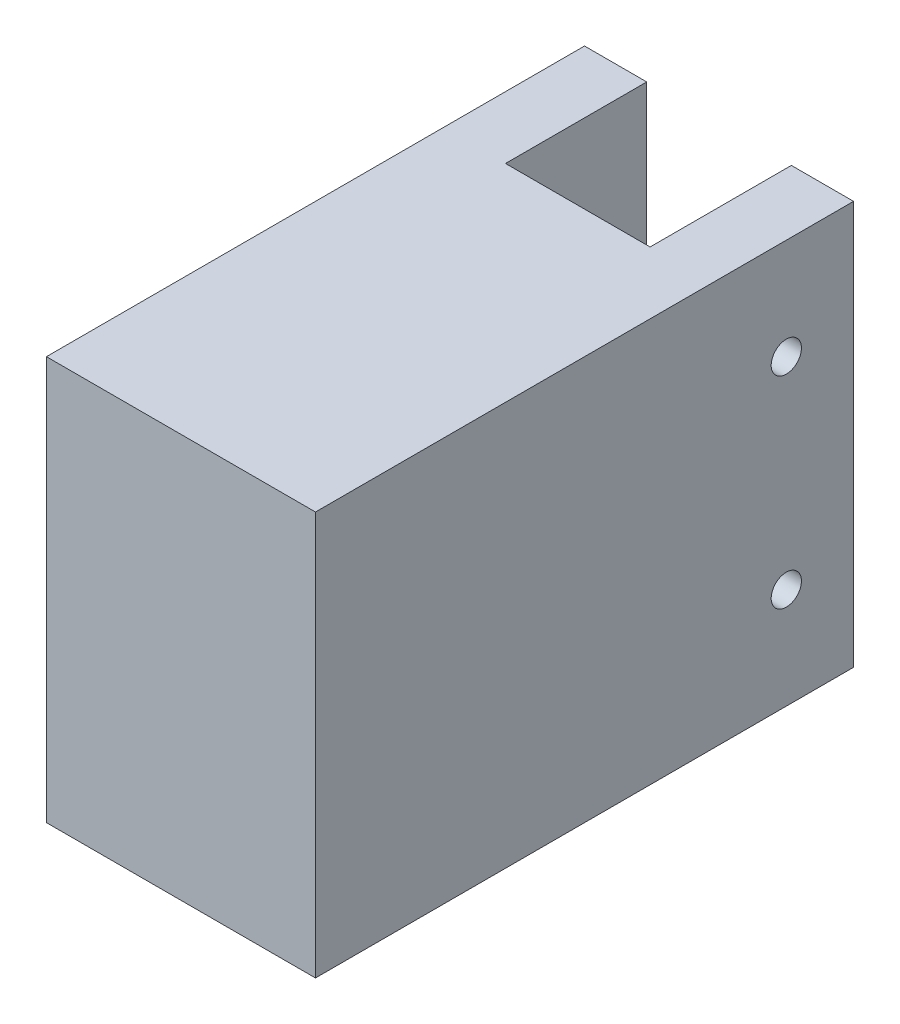
ISO-10303-21;
HEADER;
FILE_DESCRIPTION(('STEP AP214'),'2;1');
FILE_NAME('part.step','',(''),(''),'','','');
FILE_SCHEMA(('AUTOMOTIVE_DESIGN { 1 0 10303 214 1 1 1 1 }'));
ENDSEC;
DATA;
#1=APPLICATION_CONTEXT('core data for automotive mechanical design processes');
#2=APPLICATION_PROTOCOL_DEFINITION('international standard','automotive_design',2000,#1);
#3=PRODUCT_CONTEXT('',#1,'mechanical');
#4=PRODUCT('Part','Part','',(#3));
#5=PRODUCT_RELATED_PRODUCT_CATEGORY('part','',(#4));
#6=PRODUCT_DEFINITION_FORMATION('','',#4);
#7=PRODUCT_DEFINITION_CONTEXT('part definition',#1,'design');
#8=PRODUCT_DEFINITION('design','',#6,#7);
#9=PRODUCT_DEFINITION_SHAPE('','',#8);
#10=(LENGTH_UNIT() NAMED_UNIT(*) SI_UNIT(.MILLI.,.METRE.));
#11=(NAMED_UNIT(*) PLANE_ANGLE_UNIT() SI_UNIT($,.RADIAN.));
#12=(NAMED_UNIT(*) SI_UNIT($,.STERADIAN.) SOLID_ANGLE_UNIT());
#13=UNCERTAINTY_MEASURE_WITH_UNIT(LENGTH_MEASURE(1.E-05),#10,'distance_accuracy_value','');
#14=(GEOMETRIC_REPRESENTATION_CONTEXT(3) GLOBAL_UNCERTAINTY_ASSIGNED_CONTEXT((#13)) GLOBAL_UNIT_ASSIGNED_CONTEXT((#10,
#11,#12)) REPRESENTATION_CONTEXT('',''));
#15=CARTESIAN_POINT('',(0.,0.,0.));
#16=DIRECTION('',(0.,0.,1.));
#17=DIRECTION('',(1.,0.,0.));
#18=AXIS2_PLACEMENT_3D('',#15,#16,#17);
#19=CARTESIAN_POINT('',(40.,0.,0.));
#20=DIRECTION('',(-1.,0.,0.));
#21=DIRECTION('',(0.,0.,1.));
#22=AXIS2_PLACEMENT_3D('',#19,#20,#21);
#23=CYLINDRICAL_SURFACE('',#22,17.65);
#24=CARTESIAN_POINT('',(0.,0.,0.));
#25=DIRECTION('',(1.,0.,0.));
#26=DIRECTION('',(0.,0.,-1.));
#27=AXIS2_PLACEMENT_3D('',#24,#25,#26);
#28=CIRCLE('',#27,17.65);
#29=CARTESIAN_POINT('',(0.,0.,-17.65));
#30=VERTEX_POINT('',#29);
#31=EDGE_CURVE('E97',#30,#30,#28,.T.);
#32=ORIENTED_EDGE('',*,*,#31,.F.);
#33=EDGE_LOOP('',(#32));
#34=FACE_BOUND('',#33,.T.);
#35=CARTESIAN_POINT('',(25.,0.,0.));
#36=DIRECTION('',(1.,0.,0.));
#37=DIRECTION('',(0.,0.,-1.));
#38=AXIS2_PLACEMENT_3D('',#35,#36,#37);
#39=CIRCLE('',#38,17.65);
#40=CARTESIAN_POINT('',(25.,0.,-17.65));
#41=VERTEX_POINT('',#40);
#42=EDGE_CURVE('E133',#41,#41,#39,.T.);
#43=ORIENTED_EDGE('',*,*,#42,.T.);
#44=EDGE_LOOP('',(#43));
#45=FACE_BOUND('',#44,.T.);
#46=ADVANCED_FACE('F33',(#34,#45),#23,.F.);
#47=CARTESIAN_POINT('',(40.,0.,0.));
#48=DIRECTION('',(1.,0.,0.));
#49=DIRECTION('',(0.,0.,-1.));
#50=AXIS2_PLACEMENT_3D('',#47,#48,#49);
#51=PLANE('',#50);
#52=CARTESIAN_POINT('',(40.,-15.,-40.));
#53=DIRECTION('',(1.,0.,0.));
#54=DIRECTION('',(0.,0.,-1.));
#55=AXIS2_PLACEMENT_3D('',#52,#53,#54);
#56=CIRCLE('',#55,2.25);
#57=CARTESIAN_POINT('',(40.,-15.,-42.25));
#58=VERTEX_POINT('',#57);
#59=EDGE_CURVE('E149',#58,#58,#56,.T.);
#60=ORIENTED_EDGE('',*,*,#59,.F.);
#61=EDGE_LOOP('',(#60));
#62=FACE_BOUND('',#61,.T.);
#63=CARTESIAN_POINT('',(40.,15.,-40.));
#64=DIRECTION('',(1.,0.,0.));
#65=DIRECTION('',(0.,0.,1.));
#66=AXIS2_PLACEMENT_3D('',#63,#64,#65);
#67=CIRCLE('',#66,2.25);
#68=CARTESIAN_POINT('',(40.,15.,-37.75));
#69=VERTEX_POINT('',#68);
#70=EDGE_CURVE('E148',#69,#69,#67,.T.);
#71=ORIENTED_EDGE('',*,*,#70,.F.);
#72=EDGE_LOOP('',(#71));
#73=FACE_BOUND('',#72,.T.);
#74=DIRECTION('',(0.,-1.,0.));
#75=VECTOR('',#74,1.);
#76=CARTESIAN_POINT('',(40.,-30.,30.));
#77=LINE('',#76,#75);
#78=CARTESIAN_POINT('',(40.,30.,30.));
#79=VERTEX_POINT('',#78);
#80=CARTESIAN_POINT('',(40.,-30.,30.));
#81=VERTEX_POINT('',#80);
#82=EDGE_CURVE('E86',#79,#81,#77,.T.);
#83=ORIENTED_EDGE('',*,*,#82,.T.);
#84=DIRECTION('',(0.,0.,-1.));
#85=VECTOR('',#84,1.);
#86=CARTESIAN_POINT('',(40.,-30.,-30.));
#87=LINE('',#86,#85);
#88=CARTESIAN_POINT('',(40.,-30.,-50.));
#89=VERTEX_POINT('',#88);
#90=EDGE_CURVE('E162',#81,#89,#87,.T.);
#91=ORIENTED_EDGE('',*,*,#90,.T.);
#92=DIRECTION('',(0.,-1.,0.));
#93=VECTOR('',#92,1.);
#94=CARTESIAN_POINT('',(40.,30.,-50.));
#95=LINE('',#94,#93);
#96=CARTESIAN_POINT('',(40.,30.,-50.));
#97=VERTEX_POINT('',#96);
#98=EDGE_CURVE('E152',#97,#89,#95,.T.);
#99=ORIENTED_EDGE('',*,*,#98,.F.);
#100=DIRECTION('',(0.,0.,1.));
#101=VECTOR('',#100,1.);
#102=CARTESIAN_POINT('',(40.,30.,-30.));
#103=LINE('',#102,#101);
#104=EDGE_CURVE('E59',#97,#79,#103,.T.);
#105=ORIENTED_EDGE('',*,*,#104,.T.);
#106=EDGE_LOOP('',(#83,#91,#99,#105));
#107=FACE_BOUND('',#106,.T.);
#108=ADVANCED_FACE('F166',(#62,#73,#107),#51,.T.);
#109=CARTESIAN_POINT('',(0.,0.,0.));
#110=DIRECTION('',(1.,0.,0.));
#111=DIRECTION('',(0.,0.,-1.));
#112=AXIS2_PLACEMENT_3D('',#109,#110,#111);
#113=PLANE('',#112);
#114=CARTESIAN_POINT('',(0.,-15.,-40.));
#115=DIRECTION('',(1.,0.,0.));
#116=DIRECTION('',(0.,0.,-1.));
#117=AXIS2_PLACEMENT_3D('',#114,#115,#116);
#118=CIRCLE('',#117,2.25);
#119=CARTESIAN_POINT('',(0.,-15.,-42.25));
#120=VERTEX_POINT('',#119);
#121=EDGE_CURVE('E137',#120,#120,#118,.T.);
#122=ORIENTED_EDGE('',*,*,#121,.T.);
#123=EDGE_LOOP('',(#122));
#124=FACE_BOUND('',#123,.T.);
#125=CARTESIAN_POINT('',(0.,15.,-40.));
#126=DIRECTION('',(1.,0.,0.));
#127=DIRECTION('',(0.,0.,1.));
#128=AXIS2_PLACEMENT_3D('',#125,#126,#127);
#129=CIRCLE('',#128,2.25);
#130=CARTESIAN_POINT('',(0.,15.,-37.75));
#131=VERTEX_POINT('',#130);
#132=EDGE_CURVE('E136',#131,#131,#129,.T.);
#133=ORIENTED_EDGE('',*,*,#132,.T.);
#134=EDGE_LOOP('',(#133));
#135=FACE_BOUND('',#134,.T.);
#136=DIRECTION('',(0.,-1.,0.));
#137=VECTOR('',#136,1.);
#138=CARTESIAN_POINT('',(0.,-30.,30.));
#139=LINE('',#138,#137);
#140=CARTESIAN_POINT('',(0.,30.,30.));
#141=VERTEX_POINT('',#140);
#142=CARTESIAN_POINT('',(0.,-30.,30.));
#143=VERTEX_POINT('',#142);
#144=EDGE_CURVE('E92',#141,#143,#139,.T.);
#145=ORIENTED_EDGE('',*,*,#144,.F.);
#146=DIRECTION('',(0.,0.,1.));
#147=VECTOR('',#146,1.);
#148=CARTESIAN_POINT('',(0.,30.,-30.));
#149=LINE('',#148,#147);
#150=CARTESIAN_POINT('',(0.,30.,-50.));
#151=VERTEX_POINT('',#150);
#152=EDGE_CURVE('E73',#151,#141,#149,.T.);
#153=ORIENTED_EDGE('',*,*,#152,.F.);
#154=DIRECTION('',(0.,-1.,0.));
#155=VECTOR('',#154,1.);
#156=CARTESIAN_POINT('',(0.,30.,-50.));
#157=LINE('',#156,#155);
#158=CARTESIAN_POINT('',(0.,-30.,-50.));
#159=VERTEX_POINT('',#158);
#160=EDGE_CURVE('E140',#151,#159,#157,.T.);
#161=ORIENTED_EDGE('',*,*,#160,.T.);
#162=DIRECTION('',(0.,0.,-1.));
#163=VECTOR('',#162,1.);
#164=CARTESIAN_POINT('',(0.,-30.,-30.));
#165=LINE('',#164,#163);
#166=EDGE_CURVE('E87',#143,#159,#165,.T.);
#167=ORIENTED_EDGE('',*,*,#166,.F.);
#168=EDGE_LOOP('',(#145,#153,#161,#167));
#169=FACE_BOUND('',#168,.T.);
#170=ORIENTED_EDGE('',*,*,#31,.T.);
#171=EDGE_LOOP('',(#170));
#172=FACE_BOUND('',#171,.T.);
#173=ADVANCED_FACE('F94',(#124,#135,#169,#172),#113,.F.);
#174=CARTESIAN_POINT('',(40.,-30.,30.));
#175=DIRECTION('',(0.,0.,-1.));
#176=DIRECTION('',(-1.,0.,0.));
#177=AXIS2_PLACEMENT_3D('',#174,#175,#176);
#178=PLANE('',#177);
#179=ORIENTED_EDGE('',*,*,#144,.T.);
#180=DIRECTION('',(-1.,0.,0.));
#181=VECTOR('',#180,1.);
#182=CARTESIAN_POINT('',(40.,-30.,30.));
#183=LINE('',#182,#181);
#184=EDGE_CURVE('E11',#81,#143,#183,.T.);
#185=ORIENTED_EDGE('',*,*,#184,.F.);
#186=ORIENTED_EDGE('',*,*,#82,.F.);
#187=DIRECTION('',(-1.,0.,0.));
#188=VECTOR('',#187,1.);
#189=CARTESIAN_POINT('',(40.,30.,30.));
#190=LINE('',#189,#188);
#191=EDGE_CURVE('E42',#79,#141,#190,.T.);
#192=ORIENTED_EDGE('',*,*,#191,.T.);
#193=EDGE_LOOP('',(#179,#185,#186,#192));
#194=FACE_BOUND('',#193,.T.);
#195=ADVANCED_FACE('F35',(#194),#178,.F.);
#196=CARTESIAN_POINT('',(40.,-30.,-30.));
#197=DIRECTION('',(0.,1.,0.));
#198=DIRECTION('',(0.,0.,1.));
#199=AXIS2_PLACEMENT_3D('',#196,#197,#198);
#200=PLANE('',#199);
#201=DIRECTION('',(1.,0.,0.));
#202=VECTOR('',#201,1.);
#203=CARTESIAN_POINT('',(0.,-30.,-50.));
#204=LINE('',#203,#202);
#205=CARTESIAN_POINT('',(9.25,-30.,-50.));
#206=VERTEX_POINT('',#205);
#207=EDGE_CURVE('E145',#159,#206,#204,.T.);
#208=ORIENTED_EDGE('',*,*,#207,.T.);
#209=DIRECTION('',(0.,0.,1.));
#210=VECTOR('',#209,1.);
#211=CARTESIAN_POINT('',(9.25,-30.,-50.));
#212=LINE('',#211,#210);
#213=CARTESIAN_POINT('',(9.25,-30.,-29.));
#214=VERTEX_POINT('',#213);
#215=EDGE_CURVE('E50',#206,#214,#212,.T.);
#216=ORIENTED_EDGE('',*,*,#215,.T.);
#217=DIRECTION('',(1.,0.,0.));
#218=VECTOR('',#217,1.);
#219=CARTESIAN_POINT('',(9.25,-30.,-29.));
#220=LINE('',#219,#218);
#221=CARTESIAN_POINT('',(30.75,-30.,-29.));
#222=VERTEX_POINT('',#221);
#223=EDGE_CURVE('E348',#214,#222,#220,.T.);
#224=ORIENTED_EDGE('',*,*,#223,.T.);
#225=DIRECTION('',(0.,0.,-1.));
#226=VECTOR('',#225,1.);
#227=CARTESIAN_POINT('',(30.75,-30.,-50.));
#228=LINE('',#227,#226);
#229=CARTESIAN_POINT('',(30.75,-30.,-50.));
#230=VERTEX_POINT('',#229);
#231=EDGE_CURVE('E128',#222,#230,#228,.T.);
#232=ORIENTED_EDGE('',*,*,#231,.T.);
#233=DIRECTION('',(-1.,0.,0.));
#234=VECTOR('',#233,1.);
#235=CARTESIAN_POINT('',(40.,-30.,-50.));
#236=LINE('',#235,#234);
#237=EDGE_CURVE('E157',#89,#230,#236,.T.);
#238=ORIENTED_EDGE('',*,*,#237,.F.);
#239=ORIENTED_EDGE('',*,*,#90,.F.);
#240=ORIENTED_EDGE('',*,*,#184,.T.);
#241=ORIENTED_EDGE('',*,*,#166,.T.);
#242=EDGE_LOOP('',(#208,#216,#224,#232,#238,#239,#240,#241));
#243=FACE_BOUND('',#242,.T.);
#244=ADVANCED_FACE('F171',(#243),#200,.F.);
#245=CARTESIAN_POINT('',(40.,30.,-30.));
#246=DIRECTION('',(0.,-1.,0.));
#247=DIRECTION('',(0.,0.,-1.));
#248=AXIS2_PLACEMENT_3D('',#245,#246,#247);
#249=PLANE('',#248);
#250=DIRECTION('',(1.,0.,0.));
#251=VECTOR('',#250,1.);
#252=CARTESIAN_POINT('',(9.25,30.,-29.));
#253=LINE('',#252,#251);
#254=CARTESIAN_POINT('',(9.25,30.,-29.));
#255=VERTEX_POINT('',#254);
#256=CARTESIAN_POINT('',(30.75,30.,-29.));
#257=VERTEX_POINT('',#256);
#258=EDGE_CURVE('E341',#255,#257,#253,.T.);
#259=ORIENTED_EDGE('',*,*,#258,.F.);
#260=DIRECTION('',(0.,0.,1.));
#261=VECTOR('',#260,1.);
#262=CARTESIAN_POINT('',(9.25,30.,-50.));
#263=LINE('',#262,#261);
#264=CARTESIAN_POINT('',(9.25,30.,-50.));
#265=VERTEX_POINT('',#264);
#266=EDGE_CURVE('E344',#265,#255,#263,.T.);
#267=ORIENTED_EDGE('',*,*,#266,.F.);
#268=DIRECTION('',(-1.,0.,0.));
#269=VECTOR('',#268,1.);
#270=CARTESIAN_POINT('',(0.,30.,-50.));
#271=LINE('',#270,#269);
#272=EDGE_CURVE('E81',#265,#151,#271,.T.);
#273=ORIENTED_EDGE('',*,*,#272,.T.);
#274=ORIENTED_EDGE('',*,*,#152,.T.);
#275=ORIENTED_EDGE('',*,*,#191,.F.);
#276=ORIENTED_EDGE('',*,*,#104,.F.);
#277=DIRECTION('',(1.,0.,0.));
#278=VECTOR('',#277,1.);
#279=CARTESIAN_POINT('',(40.,30.,-50.));
#280=LINE('',#279,#278);
#281=CARTESIAN_POINT('',(30.75,30.,-50.));
#282=VERTEX_POINT('',#281);
#283=EDGE_CURVE('E101',#282,#97,#280,.T.);
#284=ORIENTED_EDGE('',*,*,#283,.F.);
#285=DIRECTION('',(0.,0.,-1.));
#286=VECTOR('',#285,1.);
#287=CARTESIAN_POINT('',(30.75,30.,-50.));
#288=LINE('',#287,#286);
#289=EDGE_CURVE('E121',#257,#282,#288,.T.);
#290=ORIENTED_EDGE('',*,*,#289,.F.);
#291=EDGE_LOOP('',(#259,#267,#273,#274,#275,#276,#284,#290));
#292=FACE_BOUND('',#291,.T.);
#293=ADVANCED_FACE('F76',(#292),#249,.F.);
#294=CARTESIAN_POINT('',(0.,0.,-50.));
#295=DIRECTION('',(0.,0.,-1.));
#296=DIRECTION('',(-1.,0.,0.));
#297=AXIS2_PLACEMENT_3D('',#294,#295,#296);
#298=PLANE('',#297);
#299=DIRECTION('',(0.,1.,0.));
#300=VECTOR('',#299,1.);
#301=CARTESIAN_POINT('',(30.75,-30.,-50.));
#302=LINE('',#301,#300);
#303=EDGE_CURVE('E113',#230,#282,#302,.T.);
#304=ORIENTED_EDGE('',*,*,#303,.T.);
#305=ORIENTED_EDGE('',*,*,#283,.T.);
#306=ORIENTED_EDGE('',*,*,#98,.T.);
#307=ORIENTED_EDGE('',*,*,#237,.T.);
#308=EDGE_LOOP('',(#304,#305,#306,#307));
#309=FACE_BOUND('',#308,.T.);
#310=ADVANCED_FACE('F176',(#309),#298,.T.);
#311=CARTESIAN_POINT('',(0.,15.,-40.));
#312=DIRECTION('',(1.,0.,0.));
#313=DIRECTION('',(0.,0.,-1.));
#314=AXIS2_PLACEMENT_3D('',#311,#312,#313);
#315=CYLINDRICAL_SURFACE('',#314,2.25);
#316=CARTESIAN_POINT('',(30.75,15.,-40.));
#317=DIRECTION('',(1.,0.,0.));
#318=DIRECTION('',(0.,0.,-1.));
#319=AXIS2_PLACEMENT_3D('',#316,#317,#318);
#320=CIRCLE('',#319,2.25);
#321=CARTESIAN_POINT('',(30.75,15.,-42.25));
#322=VERTEX_POINT('',#321);
#323=EDGE_CURVE('E130',#322,#322,#320,.F.);
#324=ORIENTED_EDGE('',*,*,#323,.T.);
#325=EDGE_LOOP('',(#324));
#326=FACE_BOUND('',#325,.T.);
#327=ORIENTED_EDGE('',*,*,#70,.T.);
#328=EDGE_LOOP('',(#327));
#329=FACE_BOUND('',#328,.T.);
#330=ADVANCED_FACE('F206',(#326,#329),#315,.F.);
#331=CARTESIAN_POINT('',(0.,-15.,-40.));
#332=DIRECTION('',(1.,0.,0.));
#333=DIRECTION('',(0.,0.,-1.));
#334=AXIS2_PLACEMENT_3D('',#331,#332,#333);
#335=CYLINDRICAL_SURFACE('',#334,2.25);
#336=CARTESIAN_POINT('',(30.75,-15.,-40.));
#337=DIRECTION('',(1.,0.,0.));
#338=DIRECTION('',(0.,0.,-1.));
#339=AXIS2_PLACEMENT_3D('',#336,#337,#338);
#340=CIRCLE('',#339,2.25);
#341=CARTESIAN_POINT('',(30.75,-15.,-42.25));
#342=VERTEX_POINT('',#341);
#343=EDGE_CURVE('E37',#342,#342,#340,.F.);
#344=ORIENTED_EDGE('',*,*,#343,.T.);
#345=EDGE_LOOP('',(#344));
#346=FACE_BOUND('',#345,.T.);
#347=ORIENTED_EDGE('',*,*,#59,.T.);
#348=EDGE_LOOP('',(#347));
#349=FACE_BOUND('',#348,.T.);
#350=ADVANCED_FACE('F197',(#346,#349),#335,.F.);
#351=CARTESIAN_POINT('',(40.,0.,-50.));
#352=DIRECTION('',(0.,0.,-1.));
#353=DIRECTION('',(1.,0.,0.));
#354=AXIS2_PLACEMENT_3D('',#351,#352,#353);
#355=PLANE('',#354);
#356=DIRECTION('',(0.,1.,0.));
#357=VECTOR('',#356,1.);
#358=CARTESIAN_POINT('',(9.25,-30.,-50.));
#359=LINE('',#358,#357);
#360=EDGE_CURVE('E108',#206,#265,#359,.T.);
#361=ORIENTED_EDGE('',*,*,#360,.F.);
#362=ORIENTED_EDGE('',*,*,#207,.F.);
#363=ORIENTED_EDGE('',*,*,#160,.F.);
#364=ORIENTED_EDGE('',*,*,#272,.F.);
#365=EDGE_LOOP('',(#361,#362,#363,#364));
#366=FACE_BOUND('',#365,.T.);
#367=ADVANCED_FACE('F194',(#366),#355,.T.);
#368=CARTESIAN_POINT('',(40.,15.,-40.));
#369=DIRECTION('',(-1.,0.,0.));
#370=DIRECTION('',(0.,0.,1.));
#371=AXIS2_PLACEMENT_3D('',#368,#369,#370);
#372=CYLINDRICAL_SURFACE('',#371,2.25);
#373=CARTESIAN_POINT('',(9.25,15.,-40.));
#374=DIRECTION('',(-1.,0.,0.));
#375=DIRECTION('',(0.,0.,1.));
#376=AXIS2_PLACEMENT_3D('',#373,#374,#375);
#377=CIRCLE('',#376,2.25);
#378=CARTESIAN_POINT('',(9.25,15.,-37.75));
#379=VERTEX_POINT('',#378);
#380=EDGE_CURVE('E107',#379,#379,#377,.T.);
#381=ORIENTED_EDGE('',*,*,#380,.F.);
#382=EDGE_LOOP('',(#381));
#383=FACE_BOUND('',#382,.T.);
#384=ORIENTED_EDGE('',*,*,#132,.F.);
#385=EDGE_LOOP('',(#384));
#386=FACE_BOUND('',#385,.T.);
#387=ADVANCED_FACE('F196',(#383,#386),#372,.F.);
#388=CARTESIAN_POINT('',(40.,-15.,-40.));
#389=DIRECTION('',(-1.,0.,0.));
#390=DIRECTION('',(0.,0.,1.));
#391=AXIS2_PLACEMENT_3D('',#388,#389,#390);
#392=CYLINDRICAL_SURFACE('',#391,2.25);
#393=CARTESIAN_POINT('',(9.25,-15.,-40.));
#394=DIRECTION('',(-1.,0.,0.));
#395=DIRECTION('',(0.,0.,1.));
#396=AXIS2_PLACEMENT_3D('',#393,#394,#395);
#397=CIRCLE('',#396,2.25);
#398=CARTESIAN_POINT('',(9.25,-15.,-37.75));
#399=VERTEX_POINT('',#398);
#400=EDGE_CURVE('E105',#399,#399,#397,.T.);
#401=ORIENTED_EDGE('',*,*,#400,.F.);
#402=EDGE_LOOP('',(#401));
#403=FACE_BOUND('',#402,.T.);
#404=ORIENTED_EDGE('',*,*,#121,.F.);
#405=EDGE_LOOP('',(#404));
#406=FACE_BOUND('',#405,.T.);
#407=ADVANCED_FACE('F203',(#403,#406),#392,.F.);
#408=CARTESIAN_POINT('',(25.,0.,0.));
#409=DIRECTION('',(1.,0.,0.));
#410=DIRECTION('',(0.,0.,-1.));
#411=AXIS2_PLACEMENT_3D('',#408,#409,#410);
#412=PLANE('',#411);
#413=ORIENTED_EDGE('',*,*,#42,.F.);
#414=EDGE_LOOP('',(#413));
#415=FACE_BOUND('',#414,.T.);
#416=ADVANCED_FACE('F249',(#415),#412,.F.);
#417=CARTESIAN_POINT('',(30.75,-30.,-50.));
#418=DIRECTION('',(1.,0.,0.));
#419=DIRECTION('',(0.,0.,-1.));
#420=AXIS2_PLACEMENT_3D('',#417,#418,#419);
#421=PLANE('',#420);
#422=ORIENTED_EDGE('',*,*,#343,.F.);
#423=EDGE_LOOP('',(#422));
#424=FACE_BOUND('',#423,.T.);
#425=ORIENTED_EDGE('',*,*,#289,.T.);
#426=ORIENTED_EDGE('',*,*,#303,.F.);
#427=ORIENTED_EDGE('',*,*,#231,.F.);
#428=DIRECTION('',(0.,1.,0.));
#429=VECTOR('',#428,1.);
#430=CARTESIAN_POINT('',(30.75,-30.,-29.));
#431=LINE('',#430,#429);
#432=EDGE_CURVE('E118',#222,#257,#431,.T.);
#433=ORIENTED_EDGE('',*,*,#432,.T.);
#434=EDGE_LOOP('',(#425,#426,#427,#433));
#435=FACE_BOUND('',#434,.T.);
#436=ORIENTED_EDGE('',*,*,#323,.F.);
#437=EDGE_LOOP('',(#436));
#438=FACE_BOUND('',#437,.T.);
#439=ADVANCED_FACE('F252',(#424,#435,#438),#421,.F.);
#440=CARTESIAN_POINT('',(9.25,-30.,-50.));
#441=DIRECTION('',(-1.,0.,0.));
#442=DIRECTION('',(0.,0.,1.));
#443=AXIS2_PLACEMENT_3D('',#440,#441,#442);
#444=PLANE('',#443);
#445=ORIENTED_EDGE('',*,*,#380,.T.);
#446=EDGE_LOOP('',(#445));
#447=FACE_BOUND('',#446,.T.);
#448=ORIENTED_EDGE('',*,*,#400,.T.);
#449=EDGE_LOOP('',(#448));
#450=FACE_BOUND('',#449,.T.);
#451=ORIENTED_EDGE('',*,*,#266,.T.);
#452=DIRECTION('',(0.,1.,0.));
#453=VECTOR('',#452,1.);
#454=CARTESIAN_POINT('',(9.25,-30.,-29.));
#455=LINE('',#454,#453);
#456=EDGE_CURVE('E126',#214,#255,#455,.T.);
#457=ORIENTED_EDGE('',*,*,#456,.F.);
#458=ORIENTED_EDGE('',*,*,#215,.F.);
#459=ORIENTED_EDGE('',*,*,#360,.T.);
#460=EDGE_LOOP('',(#451,#457,#458,#459));
#461=FACE_BOUND('',#460,.T.);
#462=ADVANCED_FACE('F315',(#447,#450,#461),#444,.F.);
#463=CARTESIAN_POINT('',(9.25,-30.,-29.));
#464=DIRECTION('',(0.,0.,1.));
#465=DIRECTION('',(0.,-1.,0.));
#466=AXIS2_PLACEMENT_3D('',#463,#464,#465);
#467=PLANE('',#466);
#468=ORIENTED_EDGE('',*,*,#258,.T.);
#469=ORIENTED_EDGE('',*,*,#432,.F.);
#470=ORIENTED_EDGE('',*,*,#223,.F.);
#471=ORIENTED_EDGE('',*,*,#456,.T.);
#472=EDGE_LOOP('',(#468,#469,#470,#471));
#473=FACE_BOUND('',#472,.T.);
#474=ADVANCED_FACE('F325',(#473),#467,.F.);
#475=CLOSED_SHELL('',(#46,#108,#173,#195,#244,#293,#310,#330,#350,#367,#387,#407,#416,#439,#462,#474));
#476=MANIFOLD_SOLID_BREP('B2',#475);
#477=ADVANCED_BREP_SHAPE_REPRESENTATION('',(#18,#476),#14);
#478=SHAPE_DEFINITION_REPRESENTATION(#9,#477);
ENDSEC;
END-ISO-10303-21;
